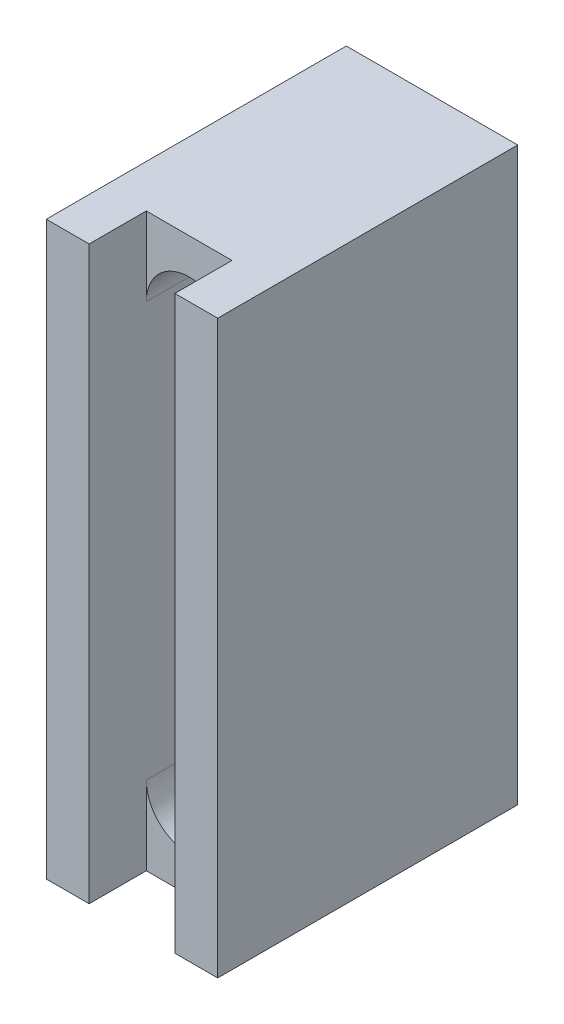
ISO-10303-21;
HEADER;
FILE_DESCRIPTION(('STEP AP214'),'2;1');
FILE_NAME('part.step','',(''),(''),'','','');
FILE_SCHEMA(('AUTOMOTIVE_DESIGN { 1 0 10303 214 1 1 1 1 }'));
ENDSEC;
DATA;
#1=APPLICATION_CONTEXT('core data for automotive mechanical design processes');
#2=APPLICATION_PROTOCOL_DEFINITION('international standard','automotive_design',2000,#1);
#3=PRODUCT_CONTEXT('',#1,'mechanical');
#4=PRODUCT('Part','Part','',(#3));
#5=PRODUCT_RELATED_PRODUCT_CATEGORY('part','',(#4));
#6=PRODUCT_DEFINITION_FORMATION('','',#4);
#7=PRODUCT_DEFINITION_CONTEXT('part definition',#1,'design');
#8=PRODUCT_DEFINITION('design','',#6,#7);
#9=PRODUCT_DEFINITION_SHAPE('','',#8);
#10=(LENGTH_UNIT() NAMED_UNIT(*) SI_UNIT(.MILLI.,.METRE.));
#11=(NAMED_UNIT(*) PLANE_ANGLE_UNIT() SI_UNIT($,.RADIAN.));
#12=(NAMED_UNIT(*) SI_UNIT($,.STERADIAN.) SOLID_ANGLE_UNIT());
#13=UNCERTAINTY_MEASURE_WITH_UNIT(LENGTH_MEASURE(1.E-05),#10,'distance_accuracy_value','');
#14=(GEOMETRIC_REPRESENTATION_CONTEXT(3) GLOBAL_UNCERTAINTY_ASSIGNED_CONTEXT((#13)) GLOBAL_UNIT_ASSIGNED_CONTEXT((#10,
#11,#12)) REPRESENTATION_CONTEXT('',''));
#15=CARTESIAN_POINT('',(0.,0.,0.));
#16=DIRECTION('',(0.,0.,1.));
#17=DIRECTION('',(1.,0.,0.));
#18=AXIS2_PLACEMENT_3D('',#15,#16,#17);
#19=CARTESIAN_POINT('',(-6.,-20.,17.));
#20=DIRECTION('',(0.,0.,1.));
#21=DIRECTION('',(1.,0.,0.));
#22=AXIS2_PLACEMENT_3D('',#19,#20,#21);
#23=PLANE('',#22);
#24=DIRECTION('',(1.,0.,0.));
#25=VECTOR('',#24,1.);
#26=CARTESIAN_POINT('',(-6.,-20.,17.));
#27=LINE('',#26,#25);
#28=CARTESIAN_POINT('',(-3.00000000000001,-20.,17.));
#29=VERTEX_POINT('',#28);
#30=CARTESIAN_POINT('',(3.,-20.,17.));
#31=VERTEX_POINT('',#30);
#32=EDGE_CURVE('E201',#29,#31,#27,.T.);
#33=ORIENTED_EDGE('',*,*,#32,.T.);
#34=DIRECTION('',(0.,-1.,0.));
#35=VECTOR('',#34,1.);
#36=CARTESIAN_POINT('',(3.,-20.,17.));
#37=LINE('',#36,#35);
#38=CARTESIAN_POINT('',(3.00000000000001,-14.5,17.));
#39=VERTEX_POINT('',#38);
#40=EDGE_CURVE('E178',#39,#31,#37,.T.);
#41=ORIENTED_EDGE('',*,*,#40,.F.);
#42=CARTESIAN_POINT('',(0.,-14.5,17.));
#43=DIRECTION('',(0.,0.,1.));
#44=DIRECTION('',(1.,0.,0.));
#45=AXIS2_PLACEMENT_3D('',#42,#43,#44);
#46=CIRCLE('',#45,3.);
#47=CARTESIAN_POINT('',(-3.,-14.5,17.));
#48=VERTEX_POINT('',#47);
#49=EDGE_CURVE('E212',#48,#39,#46,.T.);
#50=ORIENTED_EDGE('',*,*,#49,.F.);
#51=DIRECTION('',(0.,1.,0.));
#52=VECTOR('',#51,1.);
#53=CARTESIAN_POINT('',(-3.,-20.,17.));
#54=LINE('',#53,#52);
#55=EDGE_CURVE('E54',#29,#48,#54,.T.);
#56=ORIENTED_EDGE('',*,*,#55,.F.);
#57=EDGE_LOOP('',(#33,#41,#50,#56));
#58=FACE_BOUND('',#57,.T.);
#59=ADVANCED_FACE('F36',(#58),#23,.T.);
#60=CARTESIAN_POINT('',(0.,14.5,17.));
#61=DIRECTION('',(0.,0.,1.));
#62=DIRECTION('',(-1.,0.,0.));
#63=AXIS2_PLACEMENT_3D('',#60,#61,#62);
#64=CIRCLE('',#63,3.);
#65=CARTESIAN_POINT('',(3.,14.5,17.));
#66=VERTEX_POINT('',#65);
#67=CARTESIAN_POINT('',(-3.,14.5,17.));
#68=VERTEX_POINT('',#67);
#69=EDGE_CURVE('E209',#66,#68,#64,.T.);
#70=ORIENTED_EDGE('',*,*,#69,.F.);
#71=CARTESIAN_POINT('',(3.00000000000001,20.,17.));
#72=VERTEX_POINT('',#71);
#73=EDGE_CURVE('E174',#72,#66,#37,.T.);
#74=ORIENTED_EDGE('',*,*,#73,.F.);
#75=DIRECTION('',(-1.,0.,0.));
#76=VECTOR('',#75,1.);
#77=CARTESIAN_POINT('',(-6.,20.,17.));
#78=LINE('',#77,#76);
#79=CARTESIAN_POINT('',(-3.00000000000001,20.,17.));
#80=VERTEX_POINT('',#79);
#81=EDGE_CURVE('E40',#72,#80,#78,.T.);
#82=ORIENTED_EDGE('',*,*,#81,.T.);
#83=EDGE_CURVE('E11',#68,#80,#54,.T.);
#84=ORIENTED_EDGE('',*,*,#83,.F.);
#85=EDGE_LOOP('',(#70,#74,#82,#84));
#86=FACE_BOUND('',#85,.T.);
#87=ADVANCED_FACE('F358',(#86),#23,.T.);
#88=CARTESIAN_POINT('',(0.,14.5,5.));
#89=DIRECTION('',(0.,0.,-1.));
#90=DIRECTION('',(-1.,0.,0.));
#91=AXIS2_PLACEMENT_3D('',#88,#89,#90);
#92=PLANE('',#91);
#93=DIRECTION('',(1.,0.,0.));
#94=VECTOR('',#93,1.);
#95=CARTESIAN_POINT('',(3.,-1.5,5.));
#96=LINE('',#95,#94);
#97=CARTESIAN_POINT('',(-3.,-1.5,5.));
#98=VERTEX_POINT('',#97);
#99=CARTESIAN_POINT('',(3.,-1.5,5.));
#100=VERTEX_POINT('',#99);
#101=EDGE_CURVE('E233',#98,#100,#96,.T.);
#102=ORIENTED_EDGE('',*,*,#101,.F.);
#103=DIRECTION('',(0.,-1.,0.));
#104=VECTOR('',#103,1.);
#105=CARTESIAN_POINT('',(-3.,14.5,5.));
#106=LINE('',#105,#104);
#107=CARTESIAN_POINT('',(-3.,-14.5,5.));
#108=VERTEX_POINT('',#107);
#109=EDGE_CURVE('E288',#98,#108,#106,.T.);
#110=ORIENTED_EDGE('',*,*,#109,.T.);
#111=CARTESIAN_POINT('',(0.,-14.5,5.));
#112=DIRECTION('',(0.,0.,1.));
#113=DIRECTION('',(1.,0.,0.));
#114=AXIS2_PLACEMENT_3D('',#111,#112,#113);
#115=CIRCLE('',#114,3.);
#116=CARTESIAN_POINT('',(3.,-14.5,5.));
#117=VERTEX_POINT('',#116);
#118=EDGE_CURVE('E300',#108,#117,#115,.T.);
#119=ORIENTED_EDGE('',*,*,#118,.T.);
#120=DIRECTION('',(0.,1.,0.));
#121=VECTOR('',#120,1.);
#122=CARTESIAN_POINT('',(3.,-14.5,5.));
#123=LINE('',#122,#121);
#124=EDGE_CURVE('E220',#117,#100,#123,.T.);
#125=ORIENTED_EDGE('',*,*,#124,.T.);
#126=EDGE_LOOP('',(#102,#110,#119,#125));
#127=FACE_BOUND('',#126,.T.);
#128=ADVANCED_FACE('F356',(#127),#92,.F.);
#129=DIRECTION('',(-1.,0.,0.));
#130=VECTOR('',#129,1.);
#131=CARTESIAN_POINT('',(-3.,1.5,5.));
#132=LINE('',#131,#130);
#133=CARTESIAN_POINT('',(3.,1.5,5.));
#134=VERTEX_POINT('',#133);
#135=CARTESIAN_POINT('',(-3.,1.5,5.));
#136=VERTEX_POINT('',#135);
#137=EDGE_CURVE('E239',#134,#136,#132,.T.);
#138=ORIENTED_EDGE('',*,*,#137,.F.);
#139=CARTESIAN_POINT('',(3.,14.5,5.));
#140=VERTEX_POINT('',#139);
#141=EDGE_CURVE('E263',#134,#140,#123,.T.);
#142=ORIENTED_EDGE('',*,*,#141,.T.);
#143=CARTESIAN_POINT('',(0.,14.5,5.));
#144=DIRECTION('',(0.,0.,1.));
#145=DIRECTION('',(-1.,0.,0.));
#146=AXIS2_PLACEMENT_3D('',#143,#144,#145);
#147=CIRCLE('',#146,3.);
#148=CARTESIAN_POINT('',(-3.,14.5,5.));
#149=VERTEX_POINT('',#148);
#150=EDGE_CURVE('E229',#140,#149,#147,.T.);
#151=ORIENTED_EDGE('',*,*,#150,.T.);
#152=EDGE_CURVE('E297',#149,#136,#106,.T.);
#153=ORIENTED_EDGE('',*,*,#152,.T.);
#154=EDGE_LOOP('',(#138,#142,#151,#153));
#155=FACE_BOUND('',#154,.T.);
#156=ADVANCED_FACE('F298',(#155),#92,.F.);
#157=CARTESIAN_POINT('',(-6.,20.,17.));
#158=DIRECTION('',(1.,0.,0.));
#159=DIRECTION('',(0.,1.,0.));
#160=AXIS2_PLACEMENT_3D('',#157,#158,#159);
#161=PLANE('',#160);
#162=DIRECTION('',(0.,-1.,0.));
#163=VECTOR('',#162,1.);
#164=CARTESIAN_POINT('',(-6.,20.,0.));
#165=LINE('',#164,#163);
#166=CARTESIAN_POINT('',(-6.,20.,0.));
#167=VERTEX_POINT('',#166);
#168=CARTESIAN_POINT('',(-6.,-20.,0.));
#169=VERTEX_POINT('',#168);
#170=EDGE_CURVE('E319',#167,#169,#165,.T.);
#171=ORIENTED_EDGE('',*,*,#170,.T.);
#172=DIRECTION('',(0.,0.,-1.));
#173=VECTOR('',#172,1.);
#174=CARTESIAN_POINT('',(-6.,-20.,17.));
#175=LINE('',#174,#173);
#176=CARTESIAN_POINT('',(-6.,-20.,21.));
#177=VERTEX_POINT('',#176);
#178=EDGE_CURVE('E46',#177,#169,#175,.T.);
#179=ORIENTED_EDGE('',*,*,#178,.F.);
#180=DIRECTION('',(0.,-1.,0.));
#181=VECTOR('',#180,1.);
#182=CARTESIAN_POINT('',(-6.,20.,21.));
#183=LINE('',#182,#181);
#184=CARTESIAN_POINT('',(-6.,20.,21.));
#185=VERTEX_POINT('',#184);
#186=EDGE_CURVE('E188',#185,#177,#183,.T.);
#187=ORIENTED_EDGE('',*,*,#186,.F.);
#188=DIRECTION('',(0.,0.,-1.));
#189=VECTOR('',#188,1.);
#190=CARTESIAN_POINT('',(-6.,20.,17.));
#191=LINE('',#190,#189);
#192=EDGE_CURVE('E328',#185,#167,#191,.T.);
#193=ORIENTED_EDGE('',*,*,#192,.T.);
#194=EDGE_LOOP('',(#171,#179,#187,#193));
#195=FACE_BOUND('',#194,.T.);
#196=ADVANCED_FACE('F38',(#195),#161,.F.);
#197=CARTESIAN_POINT('',(-6.,-20.,17.));
#198=DIRECTION('',(0.,1.,0.));
#199=DIRECTION('',(-1.,0.,0.));
#200=AXIS2_PLACEMENT_3D('',#197,#198,#199);
#201=PLANE('',#200);
#202=DIRECTION('',(1.,0.,0.));
#203=VECTOR('',#202,1.);
#204=CARTESIAN_POINT('',(-6.,-20.,0.));
#205=LINE('',#204,#203);
#206=CARTESIAN_POINT('',(6.,-20.,0.));
#207=VERTEX_POINT('',#206);
#208=EDGE_CURVE('E339',#169,#207,#205,.T.);
#209=ORIENTED_EDGE('',*,*,#208,.T.);
#210=DIRECTION('',(0.,0.,-1.));
#211=VECTOR('',#210,1.);
#212=CARTESIAN_POINT('',(6.,-20.,17.));
#213=LINE('',#212,#211);
#214=CARTESIAN_POINT('',(6.,-20.,21.));
#215=VERTEX_POINT('',#214);
#216=EDGE_CURVE('E161',#215,#207,#213,.T.);
#217=ORIENTED_EDGE('',*,*,#216,.F.);
#218=DIRECTION('',(1.,0.,0.));
#219=VECTOR('',#218,1.);
#220=CARTESIAN_POINT('',(6.,-20.,21.));
#221=LINE('',#220,#219);
#222=CARTESIAN_POINT('',(3.,-20.,21.));
#223=VERTEX_POINT('',#222);
#224=EDGE_CURVE('E155',#223,#215,#221,.T.);
#225=ORIENTED_EDGE('',*,*,#224,.F.);
#226=DIRECTION('',(0.,0.,-1.));
#227=VECTOR('',#226,1.);
#228=CARTESIAN_POINT('',(3.,-20.,21.));
#229=LINE('',#228,#227);
#230=EDGE_CURVE('E159',#223,#31,#229,.T.);
#231=ORIENTED_EDGE('',*,*,#230,.T.);
#232=ORIENTED_EDGE('',*,*,#32,.F.);
#233=DIRECTION('',(0.,0.,-1.));
#234=VECTOR('',#233,1.);
#235=CARTESIAN_POINT('',(-3.,-20.,21.));
#236=LINE('',#235,#234);
#237=CARTESIAN_POINT('',(-3.,-20.,21.));
#238=VERTEX_POINT('',#237);
#239=EDGE_CURVE('E206',#238,#29,#236,.T.);
#240=ORIENTED_EDGE('',*,*,#239,.F.);
#241=DIRECTION('',(1.,0.,0.));
#242=VECTOR('',#241,1.);
#243=CARTESIAN_POINT('',(-6.,-20.,21.));
#244=LINE('',#243,#242);
#245=EDGE_CURVE('E191',#177,#238,#244,.T.);
#246=ORIENTED_EDGE('',*,*,#245,.F.);
#247=ORIENTED_EDGE('',*,*,#178,.T.);
#248=EDGE_LOOP('',(#209,#217,#225,#231,#232,#240,#246,#247));
#249=FACE_BOUND('',#248,.T.);
#250=ADVANCED_FACE('F157',(#249),#201,.F.);
#251=CARTESIAN_POINT('',(6.,20.,17.));
#252=DIRECTION('',(-1.,0.,0.));
#253=DIRECTION('',(0.,-1.,0.));
#254=AXIS2_PLACEMENT_3D('',#251,#252,#253);
#255=PLANE('',#254);
#256=DIRECTION('',(0.,1.,0.));
#257=VECTOR('',#256,1.);
#258=CARTESIAN_POINT('',(6.,20.,0.));
#259=LINE('',#258,#257);
#260=CARTESIAN_POINT('',(6.,20.,0.));
#261=VERTEX_POINT('',#260);
#262=EDGE_CURVE('E335',#207,#261,#259,.T.);
#263=ORIENTED_EDGE('',*,*,#262,.T.);
#264=DIRECTION('',(0.,0.,-1.));
#265=VECTOR('',#264,1.);
#266=CARTESIAN_POINT('',(6.,20.,17.));
#267=LINE('',#266,#265);
#268=CARTESIAN_POINT('',(6.,20.,21.));
#269=VERTEX_POINT('',#268);
#270=EDGE_CURVE('E344',#269,#261,#267,.T.);
#271=ORIENTED_EDGE('',*,*,#270,.F.);
#272=DIRECTION('',(0.,1.,0.));
#273=VECTOR('',#272,1.);
#274=CARTESIAN_POINT('',(6.,20.,21.));
#275=LINE('',#274,#273);
#276=EDGE_CURVE('E165',#215,#269,#275,.T.);
#277=ORIENTED_EDGE('',*,*,#276,.F.);
#278=ORIENTED_EDGE('',*,*,#216,.T.);
#279=EDGE_LOOP('',(#263,#271,#277,#278));
#280=FACE_BOUND('',#279,.T.);
#281=ADVANCED_FACE('F377',(#280),#255,.F.);
#282=CARTESIAN_POINT('',(-6.,20.,17.));
#283=DIRECTION('',(0.,-1.,0.));
#284=DIRECTION('',(0.,0.,-1.));
#285=AXIS2_PLACEMENT_3D('',#282,#283,#284);
#286=PLANE('',#285);
#287=DIRECTION('',(-1.,0.,0.));
#288=VECTOR('',#287,1.);
#289=CARTESIAN_POINT('',(-6.,20.,0.));
#290=LINE('',#289,#288);
#291=EDGE_CURVE('E334',#261,#167,#290,.T.);
#292=ORIENTED_EDGE('',*,*,#291,.T.);
#293=ORIENTED_EDGE('',*,*,#192,.F.);
#294=DIRECTION('',(-1.,0.,0.));
#295=VECTOR('',#294,1.);
#296=CARTESIAN_POINT('',(-3.00000000000001,20.,21.));
#297=LINE('',#296,#295);
#298=CARTESIAN_POINT('',(-3.00000000000001,20.,21.));
#299=VERTEX_POINT('',#298);
#300=EDGE_CURVE('E181',#299,#185,#297,.T.);
#301=ORIENTED_EDGE('',*,*,#300,.F.);
#302=DIRECTION('',(0.,0.,-1.));
#303=VECTOR('',#302,1.);
#304=CARTESIAN_POINT('',(-3.00000000000001,20.,21.));
#305=LINE('',#304,#303);
#306=EDGE_CURVE('E195',#299,#80,#305,.T.);
#307=ORIENTED_EDGE('',*,*,#306,.T.);
#308=ORIENTED_EDGE('',*,*,#81,.F.);
#309=DIRECTION('',(0.,0.,-1.));
#310=VECTOR('',#309,1.);
#311=CARTESIAN_POINT('',(3.00000000000001,20.,21.));
#312=LINE('',#311,#310);
#313=CARTESIAN_POINT('',(3.00000000000001,20.,21.));
#314=VERTEX_POINT('',#313);
#315=EDGE_CURVE('E179',#314,#72,#312,.T.);
#316=ORIENTED_EDGE('',*,*,#315,.F.);
#317=DIRECTION('',(-1.,0.,0.));
#318=VECTOR('',#317,1.);
#319=CARTESIAN_POINT('',(3.00000000000001,20.,21.));
#320=LINE('',#319,#318);
#321=EDGE_CURVE('E171',#269,#314,#320,.T.);
#322=ORIENTED_EDGE('',*,*,#321,.F.);
#323=ORIENTED_EDGE('',*,*,#270,.T.);
#324=EDGE_LOOP('',(#292,#293,#301,#307,#308,#316,#322,#323));
#325=FACE_BOUND('',#324,.T.);
#326=ADVANCED_FACE('F326',(#325),#286,.F.);
#327=CARTESIAN_POINT('',(-6.,-20.,0.));
#328=DIRECTION('',(0.,0.,1.));
#329=DIRECTION('',(1.,0.,0.));
#330=AXIS2_PLACEMENT_3D('',#327,#328,#329);
#331=PLANE('',#330);
#332=DIRECTION('',(-1.,0.,0.));
#333=VECTOR('',#332,1.);
#334=CARTESIAN_POINT('',(-3.,1.5,0.));
#335=LINE('',#334,#333);
#336=CARTESIAN_POINT('',(3.,1.5,0.));
#337=VERTEX_POINT('',#336);
#338=CARTESIAN_POINT('',(-3.,1.5,0.));
#339=VERTEX_POINT('',#338);
#340=EDGE_CURVE('E256',#337,#339,#335,.T.);
#341=ORIENTED_EDGE('',*,*,#340,.T.);
#342=DIRECTION('',(0.,-1.,0.));
#343=VECTOR('',#342,1.);
#344=CARTESIAN_POINT('',(-3.,-1.5,0.));
#345=LINE('',#344,#343);
#346=CARTESIAN_POINT('',(-3.,-1.5,0.));
#347=VERTEX_POINT('',#346);
#348=EDGE_CURVE('E245',#339,#347,#345,.T.);
#349=ORIENTED_EDGE('',*,*,#348,.T.);
#350=DIRECTION('',(1.,0.,0.));
#351=VECTOR('',#350,1.);
#352=CARTESIAN_POINT('',(3.,-1.5,0.));
#353=LINE('',#352,#351);
#354=CARTESIAN_POINT('',(3.,-1.5,0.));
#355=VERTEX_POINT('',#354);
#356=EDGE_CURVE('E278',#347,#355,#353,.T.);
#357=ORIENTED_EDGE('',*,*,#356,.T.);
#358=DIRECTION('',(0.,1.,0.));
#359=VECTOR('',#358,1.);
#360=CARTESIAN_POINT('',(3.,1.5,0.));
#361=LINE('',#360,#359);
#362=EDGE_CURVE('E274',#355,#337,#361,.T.);
#363=ORIENTED_EDGE('',*,*,#362,.T.);
#364=EDGE_LOOP('',(#341,#349,#357,#363));
#365=FACE_BOUND('',#364,.T.);
#366=ORIENTED_EDGE('',*,*,#170,.F.);
#367=ORIENTED_EDGE('',*,*,#291,.F.);
#368=ORIENTED_EDGE('',*,*,#262,.F.);
#369=ORIENTED_EDGE('',*,*,#208,.F.);
#370=EDGE_LOOP('',(#366,#367,#368,#369));
#371=FACE_BOUND('',#370,.T.);
#372=ADVANCED_FACE('F282',(#365,#371),#331,.F.);
#373=CARTESIAN_POINT('',(0.,14.5,5.));
#374=DIRECTION('',(0.,0.,1.));
#375=DIRECTION('',(1.,0.,0.));
#376=AXIS2_PLACEMENT_3D('',#373,#374,#375);
#377=CYLINDRICAL_SURFACE('',#376,3.);
#378=ORIENTED_EDGE('',*,*,#69,.T.);
#379=DIRECTION('',(0.,0.,1.));
#380=VECTOR('',#379,1.);
#381=CARTESIAN_POINT('',(-3.,14.5,5.));
#382=LINE('',#381,#380);
#383=EDGE_CURVE('E216',#149,#68,#382,.T.);
#384=ORIENTED_EDGE('',*,*,#383,.F.);
#385=ORIENTED_EDGE('',*,*,#150,.F.);
#386=DIRECTION('',(0.,0.,1.));
#387=VECTOR('',#386,1.);
#388=CARTESIAN_POINT('',(3.,14.5,5.));
#389=LINE('',#388,#387);
#390=EDGE_CURVE('E311',#140,#66,#389,.T.);
#391=ORIENTED_EDGE('',*,*,#390,.T.);
#392=EDGE_LOOP('',(#378,#384,#385,#391));
#393=FACE_BOUND('',#392,.T.);
#394=ADVANCED_FACE('F320',(#393),#377,.F.);
#395=CARTESIAN_POINT('',(3.,-14.5,5.));
#396=DIRECTION('',(1.,0.,0.));
#397=DIRECTION('',(0.,0.,-1.));
#398=AXIS2_PLACEMENT_3D('',#395,#396,#397);
#399=PLANE('',#398);
#400=DIRECTION('',(0.,0.,1.));
#401=VECTOR('',#400,1.);
#402=CARTESIAN_POINT('',(3.,-14.5,5.));
#403=LINE('',#402,#401);
#404=EDGE_CURVE('E224',#117,#39,#403,.T.);
#405=ORIENTED_EDGE('',*,*,#404,.T.);
#406=ORIENTED_EDGE('',*,*,#40,.T.);
#407=ORIENTED_EDGE('',*,*,#230,.F.);
#408=DIRECTION('',(0.,-1.,0.));
#409=VECTOR('',#408,1.);
#410=CARTESIAN_POINT('',(3.,-20.,21.));
#411=LINE('',#410,#409);
#412=EDGE_CURVE('E166',#314,#223,#411,.T.);
#413=ORIENTED_EDGE('',*,*,#412,.F.);
#414=ORIENTED_EDGE('',*,*,#315,.T.);
#415=ORIENTED_EDGE('',*,*,#73,.T.);
#416=ORIENTED_EDGE('',*,*,#390,.F.);
#417=ORIENTED_EDGE('',*,*,#141,.F.);
#418=DIRECTION('',(0.,0.,1.));
#419=VECTOR('',#418,1.);
#420=CARTESIAN_POINT('',(3.,1.5,0.));
#421=LINE('',#420,#419);
#422=EDGE_CURVE('E62',#337,#134,#421,.T.);
#423=ORIENTED_EDGE('',*,*,#422,.F.);
#424=ORIENTED_EDGE('',*,*,#362,.F.);
#425=DIRECTION('',(0.,0.,1.));
#426=VECTOR('',#425,1.);
#427=CARTESIAN_POINT('',(3.,-1.5,0.));
#428=LINE('',#427,#426);
#429=EDGE_CURVE('E252',#355,#100,#428,.T.);
#430=ORIENTED_EDGE('',*,*,#429,.T.);
#431=ORIENTED_EDGE('',*,*,#124,.F.);
#432=EDGE_LOOP('',(#405,#406,#407,#413,#414,#415,#416,#417,#423,#424,#430,#431));
#433=FACE_BOUND('',#432,.T.);
#434=ADVANCED_FACE('F177',(#433),#399,.F.);
#435=CARTESIAN_POINT('',(0.,-14.5,5.));
#436=DIRECTION('',(0.,0.,1.));
#437=DIRECTION('',(1.,0.,0.));
#438=AXIS2_PLACEMENT_3D('',#435,#436,#437);
#439=CYLINDRICAL_SURFACE('',#438,3.);
#440=ORIENTED_EDGE('',*,*,#49,.T.);
#441=ORIENTED_EDGE('',*,*,#404,.F.);
#442=ORIENTED_EDGE('',*,*,#118,.F.);
#443=DIRECTION('',(0.,0.,1.));
#444=VECTOR('',#443,1.);
#445=CARTESIAN_POINT('',(-3.,-14.5,5.));
#446=LINE('',#445,#444);
#447=EDGE_CURVE('E219',#108,#48,#446,.T.);
#448=ORIENTED_EDGE('',*,*,#447,.T.);
#449=EDGE_LOOP('',(#440,#441,#442,#448));
#450=FACE_BOUND('',#449,.T.);
#451=ADVANCED_FACE('F355',(#450),#439,.F.);
#452=CARTESIAN_POINT('',(-3.,14.5,5.));
#453=DIRECTION('',(-1.,0.,0.));
#454=DIRECTION('',(0.,-1.,0.));
#455=AXIS2_PLACEMENT_3D('',#452,#453,#454);
#456=PLANE('',#455);
#457=ORIENTED_EDGE('',*,*,#383,.T.);
#458=ORIENTED_EDGE('',*,*,#83,.T.);
#459=ORIENTED_EDGE('',*,*,#306,.F.);
#460=DIRECTION('',(0.,1.,0.));
#461=VECTOR('',#460,1.);
#462=CARTESIAN_POINT('',(-3.,-20.,21.));
#463=LINE('',#462,#461);
#464=EDGE_CURVE('E193',#238,#299,#463,.T.);
#465=ORIENTED_EDGE('',*,*,#464,.F.);
#466=ORIENTED_EDGE('',*,*,#239,.T.);
#467=ORIENTED_EDGE('',*,*,#55,.T.);
#468=ORIENTED_EDGE('',*,*,#447,.F.);
#469=ORIENTED_EDGE('',*,*,#109,.F.);
#470=DIRECTION('',(0.,0.,1.));
#471=VECTOR('',#470,1.);
#472=CARTESIAN_POINT('',(-3.,-1.5,0.));
#473=LINE('',#472,#471);
#474=EDGE_CURVE('E271',#347,#98,#473,.T.);
#475=ORIENTED_EDGE('',*,*,#474,.F.);
#476=ORIENTED_EDGE('',*,*,#348,.F.);
#477=DIRECTION('',(0.,0.,1.));
#478=VECTOR('',#477,1.);
#479=CARTESIAN_POINT('',(-3.,1.5,0.));
#480=LINE('',#479,#478);
#481=EDGE_CURVE('E213',#339,#136,#480,.T.);
#482=ORIENTED_EDGE('',*,*,#481,.T.);
#483=ORIENTED_EDGE('',*,*,#152,.F.);
#484=EDGE_LOOP('',(#457,#458,#459,#465,#466,#467,#468,#469,#475,#476,#482,#483));
#485=FACE_BOUND('',#484,.T.);
#486=ADVANCED_FACE('F284',(#485),#456,.F.);
#487=CARTESIAN_POINT('',(-3.,1.5,0.));
#488=DIRECTION('',(0.,1.,0.));
#489=DIRECTION('',(-1.,0.,0.));
#490=AXIS2_PLACEMENT_3D('',#487,#488,#489);
#491=PLANE('',#490);
#492=ORIENTED_EDGE('',*,*,#137,.T.);
#493=ORIENTED_EDGE('',*,*,#481,.F.);
#494=ORIENTED_EDGE('',*,*,#340,.F.);
#495=ORIENTED_EDGE('',*,*,#422,.T.);
#496=EDGE_LOOP('',(#492,#493,#494,#495));
#497=FACE_BOUND('',#496,.T.);
#498=ADVANCED_FACE('F293',(#497),#491,.F.);
#499=CARTESIAN_POINT('',(3.,-1.5,0.));
#500=DIRECTION('',(0.,-1.,0.));
#501=DIRECTION('',(0.,0.,-1.));
#502=AXIS2_PLACEMENT_3D('',#499,#500,#501);
#503=PLANE('',#502);
#504=ORIENTED_EDGE('',*,*,#101,.T.);
#505=ORIENTED_EDGE('',*,*,#429,.F.);
#506=ORIENTED_EDGE('',*,*,#356,.F.);
#507=ORIENTED_EDGE('',*,*,#474,.T.);
#508=EDGE_LOOP('',(#504,#505,#506,#507));
#509=FACE_BOUND('',#508,.T.);
#510=ADVANCED_FACE('F289',(#509),#503,.F.);
#511=CARTESIAN_POINT('',(-6.,20.,21.));
#512=DIRECTION('',(0.,0.,1.));
#513=DIRECTION('',(1.,0.,0.));
#514=AXIS2_PLACEMENT_3D('',#511,#512,#513);
#515=PLANE('',#514);
#516=ORIENTED_EDGE('',*,*,#300,.T.);
#517=ORIENTED_EDGE('',*,*,#186,.T.);
#518=ORIENTED_EDGE('',*,*,#245,.T.);
#519=ORIENTED_EDGE('',*,*,#464,.T.);
#520=EDGE_LOOP('',(#516,#517,#518,#519));
#521=FACE_BOUND('',#520,.T.);
#522=ADVANCED_FACE('F331',(#521),#515,.T.);
#523=CARTESIAN_POINT('',(3.00000000000001,20.,21.));
#524=DIRECTION('',(0.,0.,-1.));
#525=DIRECTION('',(-1.,0.,0.));
#526=AXIS2_PLACEMENT_3D('',#523,#524,#525);
#527=PLANE('',#526);
#528=ORIENTED_EDGE('',*,*,#412,.T.);
#529=ORIENTED_EDGE('',*,*,#224,.T.);
#530=ORIENTED_EDGE('',*,*,#276,.T.);
#531=ORIENTED_EDGE('',*,*,#321,.T.);
#532=EDGE_LOOP('',(#528,#529,#530,#531));
#533=FACE_BOUND('',#532,.T.);
#534=ADVANCED_FACE('F169',(#533),#527,.F.);
#535=CLOSED_SHELL('',(#59,#87,#128,#156,#196,#250,#281,#326,#372,#394,#434,#451,#486,#498,#510,
#522,#534));
#536=MANIFOLD_SOLID_BREP('B2',#535);
#537=ADVANCED_BREP_SHAPE_REPRESENTATION('',(#18,#536),#14);
#538=SHAPE_DEFINITION_REPRESENTATION(#9,#537);
ENDSEC;
END-ISO-10303-21;
